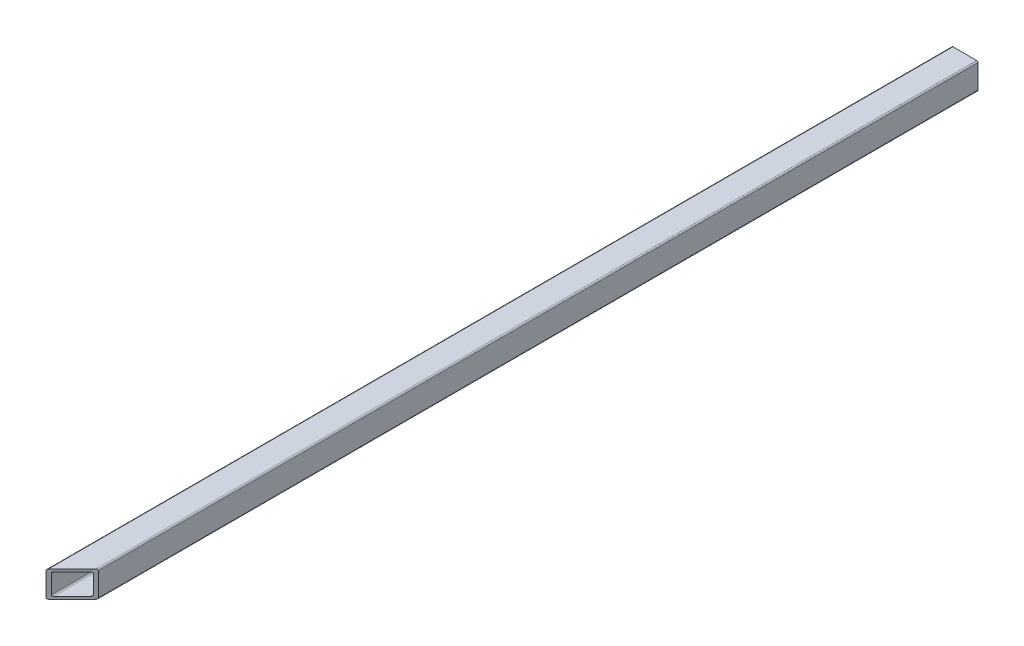
ISO-10303-21;
HEADER;
FILE_DESCRIPTION(('STEP AP214'),'2;1');
FILE_NAME('part.step','',(''),(''),'','','');
FILE_SCHEMA(('AUTOMOTIVE_DESIGN { 1 0 10303 214 1 1 1 1 }'));
ENDSEC;
DATA;
#1=APPLICATION_CONTEXT('core data for automotive mechanical design processes');
#2=APPLICATION_PROTOCOL_DEFINITION('international standard','automotive_design',2000,#1);
#3=PRODUCT_CONTEXT('',#1,'mechanical');
#4=PRODUCT('Part','Part','',(#3));
#5=PRODUCT_RELATED_PRODUCT_CATEGORY('part','',(#4));
#6=PRODUCT_DEFINITION_FORMATION('','',#4);
#7=PRODUCT_DEFINITION_CONTEXT('part definition',#1,'design');
#8=PRODUCT_DEFINITION('design','',#6,#7);
#9=PRODUCT_DEFINITION_SHAPE('','',#8);
#10=(LENGTH_UNIT() NAMED_UNIT(*) SI_UNIT(.MILLI.,.METRE.));
#11=(NAMED_UNIT(*) PLANE_ANGLE_UNIT() SI_UNIT($,.RADIAN.));
#12=(NAMED_UNIT(*) SI_UNIT($,.STERADIAN.) SOLID_ANGLE_UNIT());
#13=UNCERTAINTY_MEASURE_WITH_UNIT(LENGTH_MEASURE(1.E-05),#10,'distance_accuracy_value','');
#14=(GEOMETRIC_REPRESENTATION_CONTEXT(3) GLOBAL_UNCERTAINTY_ASSIGNED_CONTEXT((#13)) GLOBAL_UNIT_ASSIGNED_CONTEXT((#10,
#11,#12)) REPRESENTATION_CONTEXT('',''));
#15=CARTESIAN_POINT('',(0.,0.,0.));
#16=DIRECTION('',(0.,0.,1.));
#17=DIRECTION('',(1.,0.,0.));
#18=AXIS2_PLACEMENT_3D('',#15,#16,#17);
#19=CARTESIAN_POINT('',(2.,2.,0.));
#20=DIRECTION('',(0.,0.,-1.));
#21=DIRECTION('',(-1.,0.,0.));
#22=AXIS2_PLACEMENT_3D('',#19,#20,#21);
#23=PLANE('',#22);
#24=CARTESIAN_POINT('',(2.,2.,0.));
#25=DIRECTION('',(0.,0.,1.));
#26=DIRECTION('',(-1.,0.,0.));
#27=AXIS2_PLACEMENT_3D('',#24,#25,#26);
#28=CIRCLE('',#27,2.);
#29=CARTESIAN_POINT('',(0.,2.00000000000001,0.));
#30=VERTEX_POINT('',#29);
#31=CARTESIAN_POINT('',(2.00000000000001,0.,0.));
#32=VERTEX_POINT('',#31);
#33=EDGE_CURVE('E197',#30,#32,#28,.T.);
#34=ORIENTED_EDGE('',*,*,#33,.F.);
#35=DIRECTION('',(0.,-1.,0.));
#36=VECTOR('',#35,1.);
#37=CARTESIAN_POINT('',(0.,2.00000000000001,0.));
#38=LINE('',#37,#36);
#39=CARTESIAN_POINT('',(0.,38.,0.));
#40=VERTEX_POINT('',#39);
#41=EDGE_CURVE('E221',#40,#30,#38,.T.);
#42=ORIENTED_EDGE('',*,*,#41,.F.);
#43=CARTESIAN_POINT('',(2.,38.,0.));
#44=DIRECTION('',(0.,0.,1.));
#45=DIRECTION('',(-1.,0.,0.));
#46=AXIS2_PLACEMENT_3D('',#43,#44,#45);
#47=CIRCLE('',#46,2.);
#48=CARTESIAN_POINT('',(2.00000000000001,40.,0.));
#49=VERTEX_POINT('',#48);
#50=EDGE_CURVE('E219',#49,#40,#47,.T.);
#51=ORIENTED_EDGE('',*,*,#50,.F.);
#52=DIRECTION('',(-1.,0.,0.));
#53=VECTOR('',#52,1.);
#54=CARTESIAN_POINT('',(2.00000000000001,40.,0.));
#55=LINE('',#54,#53);
#56=CARTESIAN_POINT('',(38.,40.,0.));
#57=VERTEX_POINT('',#56);
#58=EDGE_CURVE('E217',#57,#49,#55,.T.);
#59=ORIENTED_EDGE('',*,*,#58,.F.);
#60=CARTESIAN_POINT('',(38.,38.,0.));
#61=DIRECTION('',(0.,0.,1.));
#62=DIRECTION('',(-1.,0.,0.));
#63=AXIS2_PLACEMENT_3D('',#60,#61,#62);
#64=CIRCLE('',#63,2.);
#65=CARTESIAN_POINT('',(40.,38.,0.));
#66=VERTEX_POINT('',#65);
#67=EDGE_CURVE('E168',#66,#57,#64,.T.);
#68=ORIENTED_EDGE('',*,*,#67,.F.);
#69=DIRECTION('',(0.,1.,0.));
#70=VECTOR('',#69,1.);
#71=CARTESIAN_POINT('',(40.,2.00000000000001,0.));
#72=LINE('',#71,#70);
#73=CARTESIAN_POINT('',(40.,2.00000000000001,0.));
#74=VERTEX_POINT('',#73);
#75=EDGE_CURVE('E213',#74,#66,#72,.T.);
#76=ORIENTED_EDGE('',*,*,#75,.F.);
#77=CARTESIAN_POINT('',(38.,2.,0.));
#78=DIRECTION('',(0.,0.,1.));
#79=DIRECTION('',(-1.,0.,0.));
#80=AXIS2_PLACEMENT_3D('',#77,#78,#79);
#81=CIRCLE('',#80,2.);
#82=CARTESIAN_POINT('',(38.,0.,0.));
#83=VERTEX_POINT('',#82);
#84=EDGE_CURVE('E200',#83,#74,#81,.T.);
#85=ORIENTED_EDGE('',*,*,#84,.F.);
#86=DIRECTION('',(1.,0.,0.));
#87=VECTOR('',#86,1.);
#88=CARTESIAN_POINT('',(2.00000000000001,0.,0.));
#89=LINE('',#88,#87);
#90=EDGE_CURVE('E187',#32,#83,#89,.T.);
#91=ORIENTED_EDGE('',*,*,#90,.F.);
#92=EDGE_LOOP('',(#34,#42,#51,#59,#68,#76,#85,#91));
#93=FACE_BOUND('',#92,.T.);
#94=DIRECTION('',(1.,0.,0.));
#95=VECTOR('',#94,1.);
#96=CARTESIAN_POINT('',(6.00000000000001,4.,0.));
#97=LINE('',#96,#95);
#98=CARTESIAN_POINT('',(6.00000000000001,4.,0.));
#99=VERTEX_POINT('',#98);
#100=CARTESIAN_POINT('',(34.,4.,0.));
#101=VERTEX_POINT('',#100);
#102=EDGE_CURVE('E262',#99,#101,#97,.T.);
#103=ORIENTED_EDGE('',*,*,#102,.T.);
#104=CARTESIAN_POINT('',(34.,6.,0.));
#105=DIRECTION('',(0.,0.,1.));
#106=DIRECTION('',(1.,0.,0.));
#107=AXIS2_PLACEMENT_3D('',#104,#105,#106);
#108=CIRCLE('',#107,2.);
#109=CARTESIAN_POINT('',(36.,6.00000000000001,0.));
#110=VERTEX_POINT('',#109);
#111=EDGE_CURVE('E241',#101,#110,#108,.T.);
#112=ORIENTED_EDGE('',*,*,#111,.T.);
#113=DIRECTION('',(0.,1.,0.));
#114=VECTOR('',#113,1.);
#115=CARTESIAN_POINT('',(36.,6.00000000000001,0.));
#116=LINE('',#115,#114);
#117=CARTESIAN_POINT('',(36.,34.,0.));
#118=VERTEX_POINT('',#117);
#119=EDGE_CURVE('E244',#110,#118,#116,.T.);
#120=ORIENTED_EDGE('',*,*,#119,.T.);
#121=CARTESIAN_POINT('',(34.,34.,0.));
#122=DIRECTION('',(0.,0.,1.));
#123=DIRECTION('',(1.,0.,0.));
#124=AXIS2_PLACEMENT_3D('',#121,#122,#123);
#125=CIRCLE('',#124,2.);
#126=CARTESIAN_POINT('',(34.,36.,0.));
#127=VERTEX_POINT('',#126);
#128=EDGE_CURVE('E247',#118,#127,#125,.T.);
#129=ORIENTED_EDGE('',*,*,#128,.T.);
#130=DIRECTION('',(-1.,0.,0.));
#131=VECTOR('',#130,1.);
#132=CARTESIAN_POINT('',(6.00000000000001,36.,0.));
#133=LINE('',#132,#131);
#134=CARTESIAN_POINT('',(6.00000000000001,36.,0.));
#135=VERTEX_POINT('',#134);
#136=EDGE_CURVE('E250',#127,#135,#133,.T.);
#137=ORIENTED_EDGE('',*,*,#136,.T.);
#138=CARTESIAN_POINT('',(6.,34.,0.));
#139=DIRECTION('',(0.,0.,1.));
#140=DIRECTION('',(1.,0.,0.));
#141=AXIS2_PLACEMENT_3D('',#138,#139,#140);
#142=CIRCLE('',#141,2.);
#143=CARTESIAN_POINT('',(4.,34.,0.));
#144=VERTEX_POINT('',#143);
#145=EDGE_CURVE('E253',#135,#144,#142,.T.);
#146=ORIENTED_EDGE('',*,*,#145,.T.);
#147=DIRECTION('',(0.,-1.,0.));
#148=VECTOR('',#147,1.);
#149=CARTESIAN_POINT('',(4.,6.00000000000001,0.));
#150=LINE('',#149,#148);
#151=CARTESIAN_POINT('',(4.,6.00000000000001,0.));
#152=VERTEX_POINT('',#151);
#153=EDGE_CURVE('E256',#144,#152,#150,.T.);
#154=ORIENTED_EDGE('',*,*,#153,.T.);
#155=CARTESIAN_POINT('',(6.,6.,0.));
#156=DIRECTION('',(0.,0.,1.));
#157=DIRECTION('',(1.,0.,0.));
#158=AXIS2_PLACEMENT_3D('',#155,#156,#157);
#159=CIRCLE('',#158,2.);
#160=EDGE_CURVE('E259',#152,#99,#159,.T.);
#161=ORIENTED_EDGE('',*,*,#160,.T.);
#162=EDGE_LOOP('',(#103,#112,#120,#129,#137,#146,#154,#161));
#163=FACE_BOUND('',#162,.T.);
#164=ADVANCED_FACE('F33',(#93,#163),#23,.T.);
#165=CARTESIAN_POINT('',(2.,2.,1380.));
#166=DIRECTION('',(0.,0.,-1.));
#167=DIRECTION('',(-1.,0.,0.));
#168=AXIS2_PLACEMENT_3D('',#165,#166,#167);
#169=CYLINDRICAL_SURFACE('',#168,2.);
#170=DIRECTION('',(0.,0.,-1.));
#171=VECTOR('',#170,1.);
#172=CARTESIAN_POINT('',(2.00000000000001,0.,1380.));
#173=LINE('',#172,#171);
#174=CARTESIAN_POINT('',(2.00000000000001,0.,1378.));
#175=VERTEX_POINT('',#174);
#176=EDGE_CURVE('E41',#175,#32,#173,.T.);
#177=ORIENTED_EDGE('',*,*,#176,.F.);
#178=CARTESIAN_POINT('',(2.,2.,1378.));
#179=DIRECTION('',(-0.70710678118655,0.,-0.707106781186545));
#180=DIRECTION('',(0.707106781186545,0.,-0.70710678118655));
#181=AXIS2_PLACEMENT_3D('',#178,#179,#180);
#182=ELLIPSE('',#181,2.8284271247462,2.);
#183=CARTESIAN_POINT('',(0.,2.00000000000002,1380.));
#184=VERTEX_POINT('',#183);
#185=EDGE_CURVE('E239',#175,#184,#182,.T.);
#186=ORIENTED_EDGE('',*,*,#185,.T.);
#187=DIRECTION('',(0.,0.,-1.));
#188=VECTOR('',#187,1.);
#189=CARTESIAN_POINT('',(0.,2.00000000000001,1380.));
#190=LINE('',#189,#188);
#191=EDGE_CURVE('E204',#184,#30,#190,.T.);
#192=ORIENTED_EDGE('',*,*,#191,.T.);
#193=ORIENTED_EDGE('',*,*,#33,.T.);
#194=EDGE_LOOP('',(#177,#186,#192,#193));
#195=FACE_BOUND('',#194,.T.);
#196=ADVANCED_FACE('F35',(#195),#169,.T.);
#197=CARTESIAN_POINT('',(2.00000000000001,0.,1380.));
#198=DIRECTION('',(0.,1.,0.));
#199=DIRECTION('',(0.,0.,1.));
#200=AXIS2_PLACEMENT_3D('',#197,#198,#199);
#201=PLANE('',#200);
#202=DIRECTION('',(0.,0.,-1.));
#203=VECTOR('',#202,1.);
#204=CARTESIAN_POINT('',(38.,0.,1380.));
#205=LINE('',#204,#203);
#206=CARTESIAN_POINT('',(38.,0.,1342.));
#207=VERTEX_POINT('',#206);
#208=EDGE_CURVE('E179',#207,#83,#205,.T.);
#209=ORIENTED_EDGE('',*,*,#208,.F.);
#210=DIRECTION('',(-0.707106781186545,0.,0.70710678118655));
#211=VECTOR('',#210,1.);
#212=CARTESIAN_POINT('',(1.,0.,1379.));
#213=LINE('',#212,#211);
#214=EDGE_CURVE('E189',#207,#175,#213,.T.);
#215=ORIENTED_EDGE('',*,*,#214,.T.);
#216=ORIENTED_EDGE('',*,*,#176,.T.);
#217=ORIENTED_EDGE('',*,*,#90,.T.);
#218=EDGE_LOOP('',(#209,#215,#216,#217));
#219=FACE_BOUND('',#218,.T.);
#220=ADVANCED_FACE('F186',(#219),#201,.F.);
#221=CARTESIAN_POINT('',(38.,2.,1380.));
#222=DIRECTION('',(0.,0.,-1.));
#223=DIRECTION('',(-1.,0.,0.));
#224=AXIS2_PLACEMENT_3D('',#221,#222,#223);
#225=CYLINDRICAL_SURFACE('',#224,2.);
#226=DIRECTION('',(0.,0.,-1.));
#227=VECTOR('',#226,1.);
#228=CARTESIAN_POINT('',(40.,2.00000000000001,1380.));
#229=LINE('',#228,#227);
#230=CARTESIAN_POINT('',(40.,2.00000000000002,1340.));
#231=VERTEX_POINT('',#230);
#232=EDGE_CURVE('E172',#231,#74,#229,.T.);
#233=ORIENTED_EDGE('',*,*,#232,.F.);
#234=CARTESIAN_POINT('',(38.,2.,1342.));
#235=DIRECTION('',(-0.70710678118655,0.,-0.707106781186545));
#236=DIRECTION('',(0.707106781186545,0.,-0.70710678118655));
#237=AXIS2_PLACEMENT_3D('',#234,#235,#236);
#238=ELLIPSE('',#237,2.8284271247462,2.);
#239=EDGE_CURVE('E155',#231,#207,#238,.T.);
#240=ORIENTED_EDGE('',*,*,#239,.T.);
#241=ORIENTED_EDGE('',*,*,#208,.T.);
#242=ORIENTED_EDGE('',*,*,#84,.T.);
#243=EDGE_LOOP('',(#233,#240,#241,#242));
#244=FACE_BOUND('',#243,.T.);
#245=ADVANCED_FACE('F313',(#244),#225,.T.);
#246=CARTESIAN_POINT('',(40.,2.00000000000001,1380.));
#247=DIRECTION('',(-1.,0.,0.));
#248=DIRECTION('',(0.,0.,1.));
#249=AXIS2_PLACEMENT_3D('',#246,#247,#248);
#250=PLANE('',#249);
#251=DIRECTION('',(0.,0.,-1.));
#252=VECTOR('',#251,1.);
#253=CARTESIAN_POINT('',(40.,38.,1380.));
#254=LINE('',#253,#252);
#255=CARTESIAN_POINT('',(40.,38.,1340.));
#256=VERTEX_POINT('',#255);
#257=EDGE_CURVE('E170',#256,#66,#254,.T.);
#258=ORIENTED_EDGE('',*,*,#257,.F.);
#259=DIRECTION('',(0.,1.,0.));
#260=VECTOR('',#259,1.);
#261=CARTESIAN_POINT('',(40.,-30.,1340.));
#262=LINE('',#261,#260);
#263=EDGE_CURVE('E151',#231,#256,#262,.T.);
#264=ORIENTED_EDGE('',*,*,#263,.F.);
#265=ORIENTED_EDGE('',*,*,#232,.T.);
#266=ORIENTED_EDGE('',*,*,#75,.T.);
#267=EDGE_LOOP('',(#258,#264,#265,#266));
#268=FACE_BOUND('',#267,.T.);
#269=ADVANCED_FACE('F310',(#268),#250,.F.);
#270=CARTESIAN_POINT('',(38.,38.,1380.));
#271=DIRECTION('',(0.,0.,-1.));
#272=DIRECTION('',(-1.,0.,0.));
#273=AXIS2_PLACEMENT_3D('',#270,#271,#272);
#274=CYLINDRICAL_SURFACE('',#273,2.);
#275=DIRECTION('',(0.,0.,-1.));
#276=VECTOR('',#275,1.);
#277=CARTESIAN_POINT('',(38.,40.,1380.));
#278=LINE('',#277,#276);
#279=CARTESIAN_POINT('',(38.,40.,1342.));
#280=VERTEX_POINT('',#279);
#281=EDGE_CURVE('E162',#280,#57,#278,.T.);
#282=ORIENTED_EDGE('',*,*,#281,.F.);
#283=CARTESIAN_POINT('',(38.,38.,1342.));
#284=DIRECTION('',(-0.70710678118655,0.,-0.707106781186545));
#285=DIRECTION('',(0.707106781186545,0.,-0.70710678118655));
#286=AXIS2_PLACEMENT_3D('',#283,#284,#285);
#287=ELLIPSE('',#286,2.8284271247462,2.);
#288=EDGE_CURVE('E145',#280,#256,#287,.T.);
#289=ORIENTED_EDGE('',*,*,#288,.T.);
#290=ORIENTED_EDGE('',*,*,#257,.T.);
#291=ORIENTED_EDGE('',*,*,#67,.T.);
#292=EDGE_LOOP('',(#282,#289,#290,#291));
#293=FACE_BOUND('',#292,.T.);
#294=ADVANCED_FACE('F166',(#293),#274,.T.);
#295=CARTESIAN_POINT('',(2.00000000000001,40.,1380.));
#296=DIRECTION('',(0.,-1.,0.));
#297=DIRECTION('',(0.,0.,-1.));
#298=AXIS2_PLACEMENT_3D('',#295,#296,#297);
#299=PLANE('',#298);
#300=DIRECTION('',(0.,0.,-1.));
#301=VECTOR('',#300,1.);
#302=CARTESIAN_POINT('',(2.00000000000001,40.,1380.));
#303=LINE('',#302,#301);
#304=CARTESIAN_POINT('',(2.,40.,1378.));
#305=VERTEX_POINT('',#304);
#306=EDGE_CURVE('E164',#305,#49,#303,.T.);
#307=ORIENTED_EDGE('',*,*,#306,.F.);
#308=DIRECTION('',(-0.707106781186545,0.,0.70710678118655));
#309=VECTOR('',#308,1.);
#310=CARTESIAN_POINT('',(0.,40.,1380.));
#311=LINE('',#310,#309);
#312=EDGE_CURVE('E148',#280,#305,#311,.T.);
#313=ORIENTED_EDGE('',*,*,#312,.F.);
#314=ORIENTED_EDGE('',*,*,#281,.T.);
#315=ORIENTED_EDGE('',*,*,#58,.T.);
#316=EDGE_LOOP('',(#307,#313,#314,#315));
#317=FACE_BOUND('',#316,.T.);
#318=ADVANCED_FACE('F160',(#317),#299,.F.);
#319=CARTESIAN_POINT('',(2.,38.,1380.));
#320=DIRECTION('',(0.,0.,-1.));
#321=DIRECTION('',(-1.,0.,0.));
#322=AXIS2_PLACEMENT_3D('',#319,#320,#321);
#323=CYLINDRICAL_SURFACE('',#322,2.);
#324=DIRECTION('',(0.,0.,-1.));
#325=VECTOR('',#324,1.);
#326=CARTESIAN_POINT('',(0.,38.,1380.));
#327=LINE('',#326,#325);
#328=CARTESIAN_POINT('',(0.,38.,1380.));
#329=VERTEX_POINT('',#328);
#330=EDGE_CURVE('E174',#329,#40,#327,.T.);
#331=ORIENTED_EDGE('',*,*,#330,.F.);
#332=CARTESIAN_POINT('',(2.,38.,1378.));
#333=DIRECTION('',(-0.70710678118655,0.,-0.707106781186545));
#334=DIRECTION('',(0.707106781186545,0.,-0.70710678118655));
#335=AXIS2_PLACEMENT_3D('',#332,#333,#334);
#336=ELLIPSE('',#335,2.8284271247462,2.);
#337=EDGE_CURVE('E156',#329,#305,#336,.T.);
#338=ORIENTED_EDGE('',*,*,#337,.T.);
#339=ORIENTED_EDGE('',*,*,#306,.T.);
#340=ORIENTED_EDGE('',*,*,#50,.T.);
#341=EDGE_LOOP('',(#331,#338,#339,#340));
#342=FACE_BOUND('',#341,.T.);
#343=ADVANCED_FACE('F230',(#342),#323,.T.);
#344=CARTESIAN_POINT('',(0.,2.00000000000001,1380.));
#345=DIRECTION('',(1.,0.,0.));
#346=DIRECTION('',(0.,0.,-1.));
#347=AXIS2_PLACEMENT_3D('',#344,#345,#346);
#348=PLANE('',#347);
#349=ORIENTED_EDGE('',*,*,#41,.T.);
#350=ORIENTED_EDGE('',*,*,#191,.F.);
#351=DIRECTION('',(0.,-1.,0.));
#352=VECTOR('',#351,1.);
#353=CARTESIAN_POINT('',(0.,2.00000000000001,1380.));
#354=LINE('',#353,#352);
#355=EDGE_CURVE('E210',#329,#184,#354,.T.);
#356=ORIENTED_EDGE('',*,*,#355,.F.);
#357=ORIENTED_EDGE('',*,*,#330,.T.);
#358=EDGE_LOOP('',(#349,#350,#356,#357));
#359=FACE_BOUND('',#358,.T.);
#360=ADVANCED_FACE('F227',(#359),#348,.F.);
#361=CARTESIAN_POINT('',(34.,6.,1380.));
#362=DIRECTION('',(0.,0.,-1.));
#363=DIRECTION('',(-1.,0.,0.));
#364=AXIS2_PLACEMENT_3D('',#361,#362,#363);
#365=CYLINDRICAL_SURFACE('',#364,2.);
#366=CARTESIAN_POINT('',(34.,6.,1346.));
#367=DIRECTION('',(-0.70710678118655,0.,-0.707106781186545));
#368=DIRECTION('',(0.707106781186545,0.,-0.70710678118655));
#369=AXIS2_PLACEMENT_3D('',#366,#367,#368);
#370=ELLIPSE('',#369,2.8284271247462,2.);
#371=CARTESIAN_POINT('',(36.,6.00000000000001,1344.));
#372=VERTEX_POINT('',#371);
#373=CARTESIAN_POINT('',(34.,4.,1346.));
#374=VERTEX_POINT('',#373);
#375=EDGE_CURVE('E47',#372,#374,#370,.T.);
#376=ORIENTED_EDGE('',*,*,#375,.F.);
#377=DIRECTION('',(0.,0.,-1.));
#378=VECTOR('',#377,1.);
#379=CARTESIAN_POINT('',(36.,6.00000000000001,1380.));
#380=LINE('',#379,#378);
#381=EDGE_CURVE('E205',#372,#110,#380,.T.);
#382=ORIENTED_EDGE('',*,*,#381,.T.);
#383=ORIENTED_EDGE('',*,*,#111,.F.);
#384=DIRECTION('',(0.,0.,-1.));
#385=VECTOR('',#384,1.);
#386=CARTESIAN_POINT('',(34.,4.,1380.));
#387=LINE('',#386,#385);
#388=EDGE_CURVE('E54',#374,#101,#387,.T.);
#389=ORIENTED_EDGE('',*,*,#388,.F.);
#390=EDGE_LOOP('',(#376,#382,#383,#389));
#391=FACE_BOUND('',#390,.T.);
#392=ADVANCED_FACE('F289',(#391),#365,.F.);
#393=CARTESIAN_POINT('',(36.,6.00000000000001,1380.));
#394=DIRECTION('',(-1.,0.,0.));
#395=DIRECTION('',(0.,0.,1.));
#396=AXIS2_PLACEMENT_3D('',#393,#394,#395);
#397=PLANE('',#396);
#398=DIRECTION('',(0.,-1.,0.));
#399=VECTOR('',#398,1.);
#400=CARTESIAN_POINT('',(36.,6.00000000000001,1344.));
#401=LINE('',#400,#399);
#402=CARTESIAN_POINT('',(36.,34.,1344.));
#403=VERTEX_POINT('',#402);
#404=EDGE_CURVE('E232',#403,#372,#401,.T.);
#405=ORIENTED_EDGE('',*,*,#404,.F.);
#406=DIRECTION('',(0.,0.,-1.));
#407=VECTOR('',#406,1.);
#408=CARTESIAN_POINT('',(36.,34.,1380.));
#409=LINE('',#408,#407);
#410=EDGE_CURVE('E207',#403,#118,#409,.T.);
#411=ORIENTED_EDGE('',*,*,#410,.T.);
#412=ORIENTED_EDGE('',*,*,#119,.F.);
#413=ORIENTED_EDGE('',*,*,#381,.F.);
#414=EDGE_LOOP('',(#405,#411,#412,#413));
#415=FACE_BOUND('',#414,.T.);
#416=ADVANCED_FACE('F281',(#415),#397,.T.);
#417=CARTESIAN_POINT('',(34.,34.,1380.));
#418=DIRECTION('',(0.,0.,-1.));
#419=DIRECTION('',(-1.,0.,0.));
#420=AXIS2_PLACEMENT_3D('',#417,#418,#419);
#421=CYLINDRICAL_SURFACE('',#420,2.);
#422=CARTESIAN_POINT('',(34.,34.,1346.));
#423=DIRECTION('',(-0.70710678118655,0.,-0.707106781186545));
#424=DIRECTION('',(0.707106781186545,0.,-0.70710678118655));
#425=AXIS2_PLACEMENT_3D('',#422,#423,#424);
#426=ELLIPSE('',#425,2.8284271247462,2.);
#427=CARTESIAN_POINT('',(34.,36.,1346.));
#428=VERTEX_POINT('',#427);
#429=EDGE_CURVE('E440',#428,#403,#426,.T.);
#430=ORIENTED_EDGE('',*,*,#429,.F.);
#431=DIRECTION('',(0.,0.,-1.));
#432=VECTOR('',#431,1.);
#433=CARTESIAN_POINT('',(34.,36.,1380.));
#434=LINE('',#433,#432);
#435=EDGE_CURVE('E274',#428,#127,#434,.T.);
#436=ORIENTED_EDGE('',*,*,#435,.T.);
#437=ORIENTED_EDGE('',*,*,#128,.F.);
#438=ORIENTED_EDGE('',*,*,#410,.F.);
#439=EDGE_LOOP('',(#430,#436,#437,#438));
#440=FACE_BOUND('',#439,.T.);
#441=ADVANCED_FACE('F285',(#440),#421,.F.);
#442=CARTESIAN_POINT('',(6.00000000000001,36.,1380.));
#443=DIRECTION('',(0.,-1.,0.));
#444=DIRECTION('',(0.,0.,-1.));
#445=AXIS2_PLACEMENT_3D('',#442,#443,#444);
#446=PLANE('',#445);
#447=DIRECTION('',(0.707106781186545,0.,-0.70710678118655));
#448=VECTOR('',#447,1.);
#449=CARTESIAN_POINT('',(2.99999999999999,36.,1377.));
#450=LINE('',#449,#448);
#451=CARTESIAN_POINT('',(6.00000000000001,36.,1374.));
#452=VERTEX_POINT('',#451);
#453=EDGE_CURVE('E438',#452,#428,#450,.T.);
#454=ORIENTED_EDGE('',*,*,#453,.F.);
#455=DIRECTION('',(0.,0.,-1.));
#456=VECTOR('',#455,1.);
#457=CARTESIAN_POINT('',(6.00000000000001,36.,1380.));
#458=LINE('',#457,#456);
#459=EDGE_CURVE('E272',#452,#135,#458,.T.);
#460=ORIENTED_EDGE('',*,*,#459,.T.);
#461=ORIENTED_EDGE('',*,*,#136,.F.);
#462=ORIENTED_EDGE('',*,*,#435,.F.);
#463=EDGE_LOOP('',(#454,#460,#461,#462));
#464=FACE_BOUND('',#463,.T.);
#465=ADVANCED_FACE('F365',(#464),#446,.T.);
#466=CARTESIAN_POINT('',(6.,34.,1380.));
#467=DIRECTION('',(0.,0.,-1.));
#468=DIRECTION('',(-1.,0.,0.));
#469=AXIS2_PLACEMENT_3D('',#466,#467,#468);
#470=CYLINDRICAL_SURFACE('',#469,2.);
#471=CARTESIAN_POINT('',(6.,34.,1374.));
#472=DIRECTION('',(-0.70710678118655,0.,-0.707106781186545));
#473=DIRECTION('',(0.707106781186545,0.,-0.70710678118655));
#474=AXIS2_PLACEMENT_3D('',#471,#472,#473);
#475=ELLIPSE('',#474,2.8284271247462,2.);
#476=CARTESIAN_POINT('',(4.,34.,1376.));
#477=VERTEX_POINT('',#476);
#478=EDGE_CURVE('E433',#477,#452,#475,.T.);
#479=ORIENTED_EDGE('',*,*,#478,.F.);
#480=DIRECTION('',(0.,0.,-1.));
#481=VECTOR('',#480,1.);
#482=CARTESIAN_POINT('',(4.,34.,1380.));
#483=LINE('',#482,#481);
#484=EDGE_CURVE('E270',#477,#144,#483,.T.);
#485=ORIENTED_EDGE('',*,*,#484,.T.);
#486=ORIENTED_EDGE('',*,*,#145,.F.);
#487=ORIENTED_EDGE('',*,*,#459,.F.);
#488=EDGE_LOOP('',(#479,#485,#486,#487));
#489=FACE_BOUND('',#488,.T.);
#490=ADVANCED_FACE('F374',(#489),#470,.F.);
#491=CARTESIAN_POINT('',(4.,6.00000000000001,1380.));
#492=DIRECTION('',(1.,0.,0.));
#493=DIRECTION('',(0.,0.,-1.));
#494=AXIS2_PLACEMENT_3D('',#491,#492,#493);
#495=PLANE('',#494);
#496=DIRECTION('',(0.,1.,0.));
#497=VECTOR('',#496,1.);
#498=CARTESIAN_POINT('',(4.,6.00000000000001,1376.));
#499=LINE('',#498,#497);
#500=CARTESIAN_POINT('',(4.,6.00000000000001,1376.));
#501=VERTEX_POINT('',#500);
#502=EDGE_CURVE('E431',#501,#477,#499,.T.);
#503=ORIENTED_EDGE('',*,*,#502,.F.);
#504=DIRECTION('',(0.,0.,-1.));
#505=VECTOR('',#504,1.);
#506=CARTESIAN_POINT('',(4.,6.00000000000001,1380.));
#507=LINE('',#506,#505);
#508=EDGE_CURVE('E268',#501,#152,#507,.T.);
#509=ORIENTED_EDGE('',*,*,#508,.T.);
#510=ORIENTED_EDGE('',*,*,#153,.F.);
#511=ORIENTED_EDGE('',*,*,#484,.F.);
#512=EDGE_LOOP('',(#503,#509,#510,#511));
#513=FACE_BOUND('',#512,.T.);
#514=ADVANCED_FACE('F384',(#513),#495,.T.);
#515=CARTESIAN_POINT('',(6.,6.,1380.));
#516=DIRECTION('',(0.,0.,-1.));
#517=DIRECTION('',(-1.,0.,0.));
#518=AXIS2_PLACEMENT_3D('',#515,#516,#517);
#519=CYLINDRICAL_SURFACE('',#518,2.);
#520=CARTESIAN_POINT('',(6.,6.,1374.));
#521=DIRECTION('',(-0.70710678118655,0.,-0.707106781186545));
#522=DIRECTION('',(0.707106781186545,0.,-0.70710678118655));
#523=AXIS2_PLACEMENT_3D('',#520,#521,#522);
#524=ELLIPSE('',#523,2.8284271247462,2.);
#525=CARTESIAN_POINT('',(6.00000000000001,4.,1374.));
#526=VERTEX_POINT('',#525);
#527=EDGE_CURVE('E427',#526,#501,#524,.T.);
#528=ORIENTED_EDGE('',*,*,#527,.F.);
#529=DIRECTION('',(0.,0.,-1.));
#530=VECTOR('',#529,1.);
#531=CARTESIAN_POINT('',(6.00000000000001,4.,1380.));
#532=LINE('',#531,#530);
#533=EDGE_CURVE('E266',#526,#99,#532,.T.);
#534=ORIENTED_EDGE('',*,*,#533,.T.);
#535=ORIENTED_EDGE('',*,*,#160,.F.);
#536=ORIENTED_EDGE('',*,*,#508,.F.);
#537=EDGE_LOOP('',(#528,#534,#535,#536));
#538=FACE_BOUND('',#537,.T.);
#539=ADVANCED_FACE('F394',(#538),#519,.F.);
#540=CARTESIAN_POINT('',(6.00000000000001,4.,1380.));
#541=DIRECTION('',(0.,1.,0.));
#542=DIRECTION('',(0.,0.,1.));
#543=AXIS2_PLACEMENT_3D('',#540,#541,#542);
#544=PLANE('',#543);
#545=DIRECTION('',(-0.707106781186545,0.,0.70710678118655));
#546=VECTOR('',#545,1.);
#547=CARTESIAN_POINT('',(2.99999999999999,4.,1377.));
#548=LINE('',#547,#546);
#549=EDGE_CURVE('E11',#374,#526,#548,.T.);
#550=ORIENTED_EDGE('',*,*,#549,.F.);
#551=ORIENTED_EDGE('',*,*,#388,.T.);
#552=ORIENTED_EDGE('',*,*,#102,.F.);
#553=ORIENTED_EDGE('',*,*,#533,.F.);
#554=EDGE_LOOP('',(#550,#551,#552,#553));
#555=FACE_BOUND('',#554,.T.);
#556=ADVANCED_FACE('F404',(#555),#544,.T.);
#557=CARTESIAN_POINT('',(0.,-30.,1380.));
#558=DIRECTION('',(-0.70710678118655,0.,-0.707106781186545));
#559=DIRECTION('',(-0.707106781186545,0.,0.70710678118655));
#560=AXIS2_PLACEMENT_3D('',#557,#558,#559);
#561=PLANE('',#560);
#562=ORIENTED_EDGE('',*,*,#375,.T.);
#563=ORIENTED_EDGE('',*,*,#549,.T.);
#564=ORIENTED_EDGE('',*,*,#527,.T.);
#565=ORIENTED_EDGE('',*,*,#502,.T.);
#566=ORIENTED_EDGE('',*,*,#478,.T.);
#567=ORIENTED_EDGE('',*,*,#453,.T.);
#568=ORIENTED_EDGE('',*,*,#429,.T.);
#569=ORIENTED_EDGE('',*,*,#404,.T.);
#570=EDGE_LOOP('',(#562,#563,#564,#565,#566,#567,#568,#569));
#571=FACE_BOUND('',#570,.T.);
#572=ORIENTED_EDGE('',*,*,#214,.F.);
#573=ORIENTED_EDGE('',*,*,#239,.F.);
#574=ORIENTED_EDGE('',*,*,#263,.T.);
#575=ORIENTED_EDGE('',*,*,#288,.F.);
#576=ORIENTED_EDGE('',*,*,#312,.T.);
#577=ORIENTED_EDGE('',*,*,#337,.F.);
#578=ORIENTED_EDGE('',*,*,#355,.T.);
#579=ORIENTED_EDGE('',*,*,#185,.F.);
#580=EDGE_LOOP('',(#572,#573,#574,#575,#576,#577,#578,#579));
#581=FACE_BOUND('',#580,.T.);
#582=ADVANCED_FACE('F147',(#571,#581),#561,.F.);
#583=CLOSED_SHELL('',(#164,#196,#220,#245,#269,#294,#318,#343,#360,#392,#416,#441,#465,#490,
#514,#539,#556,#582));
#584=MANIFOLD_SOLID_BREP('B2',#583);
#585=ADVANCED_BREP_SHAPE_REPRESENTATION('',(#18,#584),#14);
#586=SHAPE_DEFINITION_REPRESENTATION(#9,#585);
ENDSEC;
END-ISO-10303-21;
